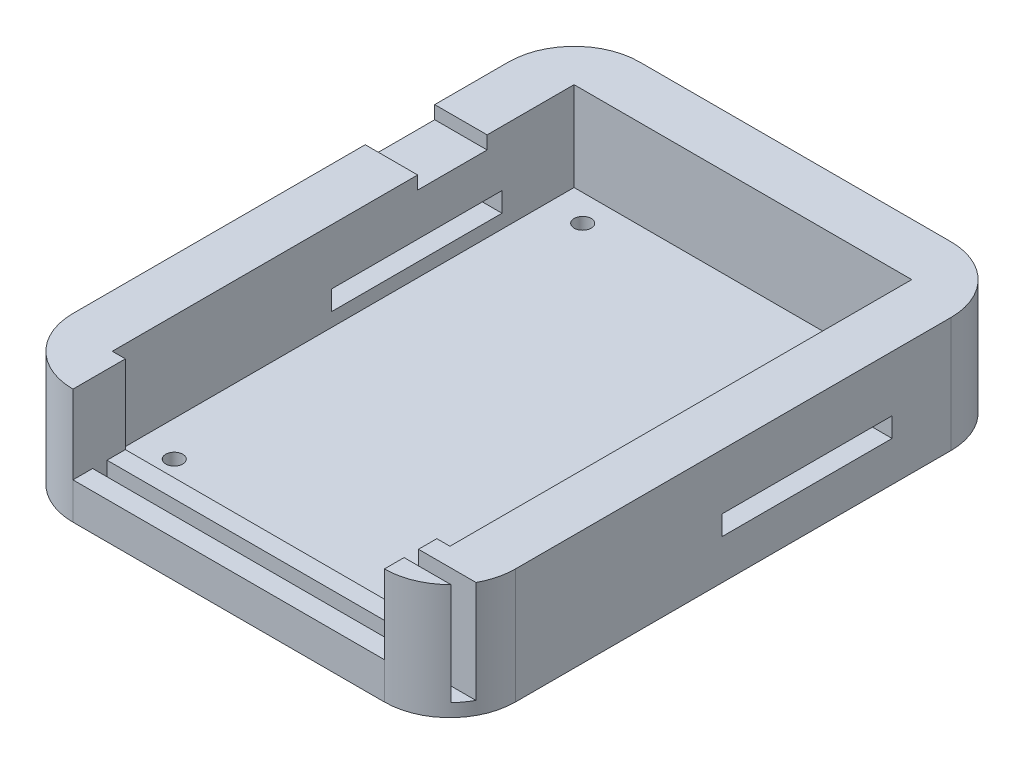
ISO-10303-21;
HEADER;
FILE_DESCRIPTION(('STEP AP214'),'2;1');
FILE_NAME('part.step','',(''),(''),'','','');
FILE_SCHEMA(('AUTOMOTIVE_DESIGN { 1 0 10303 214 1 1 1 1 }'));
ENDSEC;
DATA;
#1=APPLICATION_CONTEXT('core data for automotive mechanical design processes');
#2=APPLICATION_PROTOCOL_DEFINITION('international standard','automotive_design',2000,#1);
#3=PRODUCT_CONTEXT('',#1,'mechanical');
#4=PRODUCT('Part','Part','',(#3));
#5=PRODUCT_RELATED_PRODUCT_CATEGORY('part','',(#4));
#6=PRODUCT_DEFINITION_FORMATION('','',#4);
#7=PRODUCT_DEFINITION_CONTEXT('part definition',#1,'design');
#8=PRODUCT_DEFINITION('design','',#6,#7);
#9=PRODUCT_DEFINITION_SHAPE('','',#8);
#10=(LENGTH_UNIT() NAMED_UNIT(*) SI_UNIT(.MILLI.,.METRE.));
#11=(NAMED_UNIT(*) PLANE_ANGLE_UNIT() SI_UNIT($,.RADIAN.));
#12=(NAMED_UNIT(*) SI_UNIT($,.STERADIAN.) SOLID_ANGLE_UNIT());
#13=UNCERTAINTY_MEASURE_WITH_UNIT(LENGTH_MEASURE(1.E-05),#10,'distance_accuracy_value','');
#14=(GEOMETRIC_REPRESENTATION_CONTEXT(3) GLOBAL_UNCERTAINTY_ASSIGNED_CONTEXT((#13)) GLOBAL_UNIT_ASSIGNED_CONTEXT((#10,
#11,#12)) REPRESENTATION_CONTEXT('',''));
#15=CARTESIAN_POINT('',(0.,0.,0.));
#16=DIRECTION('',(0.,0.,1.));
#17=DIRECTION('',(1.,0.,0.));
#18=AXIS2_PLACEMENT_3D('',#15,#16,#17);
#19=CARTESIAN_POINT('',(-23.775,17.6,-33.25));
#20=DIRECTION('',(0.,1.,0.));
#21=DIRECTION('',(0.,0.,1.));
#22=AXIS2_PLACEMENT_3D('',#19,#20,#21);
#23=PLANE('',#22);
#24=DIRECTION('',(1.,0.,0.));
#25=VECTOR('',#24,1.);
#26=CARTESIAN_POINT('',(-25.775,17.6,-11.37057));
#27=LINE('',#26,#25);
#28=CARTESIAN_POINT('',(-33.775,17.6,-11.37057));
#29=VERTEX_POINT('',#28);
#30=CARTESIAN_POINT('',(-25.775,17.6,-11.37057));
#31=VERTEX_POINT('',#30);
#32=EDGE_CURVE('E315',#29,#31,#27,.T.);
#33=ORIENTED_EDGE('',*,*,#32,.F.);
#34=DIRECTION('',(0.,0.,-1.));
#35=VECTOR('',#34,1.);
#36=CARTESIAN_POINT('',(-33.775,17.6,33.25));
#37=LINE('',#36,#35);
#38=CARTESIAN_POINT('',(-33.775,17.6,33.25));
#39=VERTEX_POINT('',#38);
#40=EDGE_CURVE('E433',#39,#29,#37,.T.);
#41=ORIENTED_EDGE('',*,*,#40,.F.);
#42=CARTESIAN_POINT('',(-23.775,17.6,33.25));
#43=DIRECTION('',(0.,-1.,0.));
#44=DIRECTION('',(0.,0.,1.));
#45=AXIS2_PLACEMENT_3D('',#42,#43,#44);
#46=CIRCLE('',#45,10.);
#47=CARTESIAN_POINT('',(-23.775,17.6,43.25));
#48=VERTEX_POINT('',#47);
#49=EDGE_CURVE('E429',#48,#39,#46,.T.);
#50=ORIENTED_EDGE('',*,*,#49,.F.);
#51=DIRECTION('',(0.,0.,1.));
#52=VECTOR('',#51,1.);
#53=CARTESIAN_POINT('',(-23.775,17.6,43.25));
#54=LINE('',#53,#52);
#55=CARTESIAN_POINT('',(-23.775,17.6,35.25));
#56=VERTEX_POINT('',#55);
#57=EDGE_CURVE('E380',#56,#48,#54,.T.);
#58=ORIENTED_EDGE('',*,*,#57,.F.);
#59=DIRECTION('',(-1.,0.,0.));
#60=VECTOR('',#59,1.);
#61=CARTESIAN_POINT('',(-25.775,17.6,35.25));
#62=LINE('',#61,#60);
#63=CARTESIAN_POINT('',(-25.775,17.6,35.25));
#64=VERTEX_POINT('',#63);
#65=EDGE_CURVE('E396',#56,#64,#62,.T.);
#66=ORIENTED_EDGE('',*,*,#65,.T.);
#67=DIRECTION('',(0.,0.,-1.));
#68=VECTOR('',#67,1.);
#69=CARTESIAN_POINT('',(-25.775,17.6,-35.25));
#70=LINE('',#69,#68);
#71=EDGE_CURVE('E387',#64,#31,#70,.T.);
#72=ORIENTED_EDGE('',*,*,#71,.T.);
#73=EDGE_LOOP('',(#33,#41,#50,#58,#66,#72));
#74=FACE_BOUND('',#73,.T.);
#75=ADVANCED_FACE('F41',(#74),#23,.T.);
#76=DIRECTION('',(-1.,0.,0.));
#77=VECTOR('',#76,1.);
#78=CARTESIAN_POINT('',(-25.775,17.6,-21.97704));
#79=LINE('',#78,#77);
#80=CARTESIAN_POINT('',(-25.775,17.6,-21.97704));
#81=VERTEX_POINT('',#80);
#82=CARTESIAN_POINT('',(-33.775,17.6,-21.97704));
#83=VERTEX_POINT('',#82);
#84=EDGE_CURVE('E310',#81,#83,#79,.T.);
#85=ORIENTED_EDGE('',*,*,#84,.F.);
#86=CARTESIAN_POINT('',(-25.775,17.6,-35.25));
#87=VERTEX_POINT('',#86);
#88=EDGE_CURVE('E384',#81,#87,#70,.T.);
#89=ORIENTED_EDGE('',*,*,#88,.T.);
#90=DIRECTION('',(1.,0.,0.));
#91=VECTOR('',#90,1.);
#92=CARTESIAN_POINT('',(25.775,17.6,-35.25));
#93=LINE('',#92,#91);
#94=CARTESIAN_POINT('',(25.775,17.6,-35.25));
#95=VERTEX_POINT('',#94);
#96=EDGE_CURVE('E390',#87,#95,#93,.T.);
#97=ORIENTED_EDGE('',*,*,#96,.T.);
#98=DIRECTION('',(0.,0.,1.));
#99=VECTOR('',#98,1.);
#100=CARTESIAN_POINT('',(25.775,17.6,35.25));
#101=LINE('',#100,#99);
#102=CARTESIAN_POINT('',(25.775,17.6,35.25));
#103=VERTEX_POINT('',#102);
#104=EDGE_CURVE('E393',#95,#103,#101,.T.);
#105=ORIENTED_EDGE('',*,*,#104,.T.);
#106=CARTESIAN_POINT('',(23.775,17.6,35.25));
#107=VERTEX_POINT('',#106);
#108=EDGE_CURVE('E397',#103,#107,#62,.T.);
#109=ORIENTED_EDGE('',*,*,#108,.T.);
#110=DIRECTION('',(0.,0.,-1.));
#111=VECTOR('',#110,1.);
#112=CARTESIAN_POINT('',(23.775,17.6,43.25));
#113=LINE('',#112,#111);
#114=CARTESIAN_POINT('',(23.775,17.6,38.05));
#115=VERTEX_POINT('',#114);
#116=EDGE_CURVE('E361',#115,#107,#113,.T.);
#117=ORIENTED_EDGE('',*,*,#116,.F.);
#118=DIRECTION('',(1.,0.,0.));
#119=VECTOR('',#118,1.);
#120=CARTESIAN_POINT('',(-23.775,17.6,38.05));
#121=LINE('',#120,#119);
#122=CARTESIAN_POINT('',(32.5476848797845,17.6,38.05));
#123=VERTEX_POINT('',#122);
#124=EDGE_CURVE('E345',#115,#123,#121,.T.);
#125=ORIENTED_EDGE('',*,*,#124,.T.);
#126=CARTESIAN_POINT('',(23.775,17.6,33.25));
#127=DIRECTION('',(0.,-1.,0.));
#128=DIRECTION('',(0.,0.,-1.));
#129=AXIS2_PLACEMENT_3D('',#126,#127,#128);
#130=CIRCLE('',#129,10.);
#131=CARTESIAN_POINT('',(33.775,17.6,33.25));
#132=VERTEX_POINT('',#131);
#133=EDGE_CURVE('E426',#132,#123,#130,.T.);
#134=ORIENTED_EDGE('',*,*,#133,.F.);
#135=DIRECTION('',(0.,0.,1.));
#136=VECTOR('',#135,1.);
#137=CARTESIAN_POINT('',(33.775,17.6,33.25));
#138=LINE('',#137,#136);
#139=CARTESIAN_POINT('',(33.775,17.6,-33.25));
#140=VERTEX_POINT('',#139);
#141=EDGE_CURVE('E422',#140,#132,#138,.T.);
#142=ORIENTED_EDGE('',*,*,#141,.F.);
#143=CARTESIAN_POINT('',(23.775,17.6,-33.25));
#144=DIRECTION('',(0.,-1.,0.));
#145=DIRECTION('',(0.,0.,-1.));
#146=AXIS2_PLACEMENT_3D('',#143,#144,#145);
#147=CIRCLE('',#146,10.);
#148=CARTESIAN_POINT('',(23.775,17.6,-43.25));
#149=VERTEX_POINT('',#148);
#150=EDGE_CURVE('E419',#149,#140,#147,.T.);
#151=ORIENTED_EDGE('',*,*,#150,.F.);
#152=DIRECTION('',(1.,0.,0.));
#153=VECTOR('',#152,1.);
#154=CARTESIAN_POINT('',(-23.775,17.6,-43.25));
#155=LINE('',#154,#153);
#156=CARTESIAN_POINT('',(-23.775,17.6,-43.25));
#157=VERTEX_POINT('',#156);
#158=EDGE_CURVE('E415',#157,#149,#155,.T.);
#159=ORIENTED_EDGE('',*,*,#158,.F.);
#160=CARTESIAN_POINT('',(-23.775,17.6,-33.25));
#161=DIRECTION('',(0.,-1.,0.));
#162=DIRECTION('',(0.,0.,1.));
#163=AXIS2_PLACEMENT_3D('',#160,#161,#162);
#164=CIRCLE('',#163,10.);
#165=CARTESIAN_POINT('',(-33.775,17.6,-33.25));
#166=VERTEX_POINT('',#165);
#167=EDGE_CURVE('E412',#166,#157,#164,.T.);
#168=ORIENTED_EDGE('',*,*,#167,.F.);
#169=EDGE_CURVE('E432',#83,#166,#37,.T.);
#170=ORIENTED_EDGE('',*,*,#169,.F.);
#171=EDGE_LOOP('',(#85,#89,#97,#105,#109,#117,#125,#134,#142,#151,#159,#168,#170));
#172=FACE_BOUND('',#171,.T.);
#173=ADVANCED_FACE('F589',(#172),#23,.T.);
#174=CARTESIAN_POINT('',(23.775,5.6,43.25));
#175=DIRECTION('',(1.,0.,0.));
#176=DIRECTION('',(0.,0.,-1.));
#177=AXIS2_PLACEMENT_3D('',#174,#175,#176);
#178=PLANE('',#177);
#179=DIRECTION('',(0.,-1.,0.));
#180=VECTOR('',#179,1.);
#181=CARTESIAN_POINT('',(23.775,5.6,38.05));
#182=LINE('',#181,#180);
#183=CARTESIAN_POINT('',(23.775,5.6,38.05));
#184=VERTEX_POINT('',#183);
#185=EDGE_CURVE('E351',#115,#184,#182,.T.);
#186=ORIENTED_EDGE('',*,*,#185,.F.);
#187=ORIENTED_EDGE('',*,*,#116,.T.);
#188=DIRECTION('',(0.,1.,0.));
#189=VECTOR('',#188,1.);
#190=CARTESIAN_POINT('',(23.775,5.6,35.25));
#191=LINE('',#190,#189);
#192=CARTESIAN_POINT('',(23.775,5.6,35.25));
#193=VERTEX_POINT('',#192);
#194=EDGE_CURVE('E376',#193,#107,#191,.T.);
#195=ORIENTED_EDGE('',*,*,#194,.F.);
#196=DIRECTION('',(0.,0.,-1.));
#197=VECTOR('',#196,1.);
#198=CARTESIAN_POINT('',(23.775,5.6,43.25));
#199=LINE('',#198,#197);
#200=EDGE_CURVE('E366',#184,#193,#199,.T.);
#201=ORIENTED_EDGE('',*,*,#200,.F.);
#202=EDGE_LOOP('',(#186,#187,#195,#201));
#203=FACE_BOUND('',#202,.T.);
#204=ADVANCED_FACE('F585',(#203),#178,.F.);
#205=CARTESIAN_POINT('',(0.,5.6,0.));
#206=DIRECTION('',(0.,1.,0.));
#207=DIRECTION('',(0.,0.,1.));
#208=AXIS2_PLACEMENT_3D('',#205,#206,#207);
#209=PLANE('',#208);
#210=DIRECTION('',(0.,0.,1.));
#211=VECTOR('',#210,1.);
#212=CARTESIAN_POINT('',(-23.775,5.6,43.25));
#213=LINE('',#212,#211);
#214=CARTESIAN_POINT('',(-23.775,5.6,35.25));
#215=VERTEX_POINT('',#214);
#216=CARTESIAN_POINT('',(-23.775,5.6,38.05));
#217=VERTEX_POINT('',#216);
#218=EDGE_CURVE('E370',#215,#217,#213,.T.);
#219=ORIENTED_EDGE('',*,*,#218,.T.);
#220=DIRECTION('',(1.,0.,0.));
#221=VECTOR('',#220,1.);
#222=CARTESIAN_POINT('',(0.,5.6,38.05));
#223=LINE('',#222,#221);
#224=EDGE_CURVE('E514',#217,#184,#223,.T.);
#225=ORIENTED_EDGE('',*,*,#224,.T.);
#226=ORIENTED_EDGE('',*,*,#200,.T.);
#227=DIRECTION('',(-1.,0.,0.));
#228=VECTOR('',#227,1.);
#229=CARTESIAN_POINT('',(23.775,5.6,35.25));
#230=LINE('',#229,#228);
#231=EDGE_CURVE('E365',#193,#215,#230,.T.);
#232=ORIENTED_EDGE('',*,*,#231,.T.);
#233=EDGE_LOOP('',(#219,#225,#226,#232));
#234=FACE_BOUND('',#233,.T.);
#235=ADVANCED_FACE('F580',(#234),#209,.T.);
#236=CARTESIAN_POINT('',(-23.775,17.6,43.25));
#237=DIRECTION('',(0.,0.,1.));
#238=DIRECTION('',(1.,0.,0.));
#239=AXIS2_PLACEMENT_3D('',#236,#237,#238);
#240=PLANE('',#239);
#241=DIRECTION('',(0.,-1.,0.));
#242=VECTOR('',#241,1.);
#243=CARTESIAN_POINT('',(23.775,17.6,43.25));
#244=LINE('',#243,#242);
#245=CARTESIAN_POINT('',(23.775,5.6,43.25));
#246=VERTEX_POINT('',#245);
#247=CARTESIAN_POINT('',(23.775,0.,43.25));
#248=VERTEX_POINT('',#247);
#249=EDGE_CURVE('E471',#246,#248,#244,.T.);
#250=ORIENTED_EDGE('',*,*,#249,.F.);
#251=DIRECTION('',(1.,0.,0.));
#252=VECTOR('',#251,1.);
#253=CARTESIAN_POINT('',(23.775,5.6,43.25));
#254=LINE('',#253,#252);
#255=CARTESIAN_POINT('',(-23.775,5.6,43.25));
#256=VERTEX_POINT('',#255);
#257=EDGE_CURVE('E373',#256,#246,#254,.T.);
#258=ORIENTED_EDGE('',*,*,#257,.F.);
#259=DIRECTION('',(0.,-1.,0.));
#260=VECTOR('',#259,1.);
#261=CARTESIAN_POINT('',(-23.775,17.6,43.25));
#262=LINE('',#261,#260);
#263=CARTESIAN_POINT('',(-23.775,0.,43.25));
#264=VERTEX_POINT('',#263);
#265=EDGE_CURVE('E467',#256,#264,#262,.T.);
#266=ORIENTED_EDGE('',*,*,#265,.T.);
#267=DIRECTION('',(-1.,0.,0.));
#268=VECTOR('',#267,1.);
#269=CARTESIAN_POINT('',(-23.775,0.,43.25));
#270=LINE('',#269,#268);
#271=EDGE_CURVE('E451',#248,#264,#270,.T.);
#272=ORIENTED_EDGE('',*,*,#271,.F.);
#273=EDGE_LOOP('',(#250,#258,#266,#272));
#274=FACE_BOUND('',#273,.T.);
#275=ADVANCED_FACE('F615',(#274),#240,.T.);
#276=CARTESIAN_POINT('',(0.,4.,0.));
#277=DIRECTION('',(0.,-1.,0.));
#278=DIRECTION('',(0.,0.,-1.));
#279=AXIS2_PLACEMENT_3D('',#276,#277,#278);
#280=PLANE('',#279);
#281=DIRECTION('',(0.,0.,-1.));
#282=VECTOR('',#281,1.);
#283=CARTESIAN_POINT('',(25.775,4.,35.25));
#284=LINE('',#283,#282);
#285=CARTESIAN_POINT('',(25.775,4.,35.25));
#286=VERTEX_POINT('',#285);
#287=CARTESIAN_POINT('',(25.775,4.,-35.25));
#288=VERTEX_POINT('',#287);
#289=EDGE_CURVE('E500',#286,#288,#284,.T.);
#290=ORIENTED_EDGE('',*,*,#289,.T.);
#291=DIRECTION('',(-1.,0.,0.));
#292=VECTOR('',#291,1.);
#293=CARTESIAN_POINT('',(-25.775,4.,-35.25));
#294=LINE('',#293,#292);
#295=CARTESIAN_POINT('',(-25.775,4.,-35.25));
#296=VERTEX_POINT('',#295);
#297=EDGE_CURVE('E505',#288,#296,#294,.T.);
#298=ORIENTED_EDGE('',*,*,#297,.T.);
#299=DIRECTION('',(0.,0.,1.));
#300=VECTOR('',#299,1.);
#301=CARTESIAN_POINT('',(-25.775,4.,35.25));
#302=LINE('',#301,#300);
#303=CARTESIAN_POINT('',(-25.775,4.,35.25));
#304=VERTEX_POINT('',#303);
#305=EDGE_CURVE('E508',#296,#304,#302,.T.);
#306=ORIENTED_EDGE('',*,*,#305,.T.);
#307=DIRECTION('',(1.,0.,0.));
#308=VECTOR('',#307,1.);
#309=CARTESIAN_POINT('',(-25.775,4.,35.25));
#310=LINE('',#309,#308);
#311=EDGE_CURVE('E511',#304,#286,#310,.T.);
#312=ORIENTED_EDGE('',*,*,#311,.T.);
#313=EDGE_LOOP('',(#290,#298,#306,#312));
#314=FACE_BOUND('',#313,.T.);
#315=CARTESIAN_POINT('',(-20.3835,4.,-31.1785));
#316=DIRECTION('',(0.,1.,0.));
#317=DIRECTION('',(0.,0.,1.));
#318=AXIS2_PLACEMENT_3D('',#315,#316,#317);
#319=CIRCLE('',#318,1.3);
#320=CARTESIAN_POINT('',(-20.3835,4.,-29.8785));
#321=VERTEX_POINT('',#320);
#322=EDGE_CURVE('E497',#321,#321,#319,.T.);
#323=ORIENTED_EDGE('',*,*,#322,.F.);
#324=EDGE_LOOP('',(#323));
#325=FACE_BOUND('',#324,.T.);
#326=CARTESIAN_POINT('',(20.3835,4.,-31.1785));
#327=DIRECTION('',(0.,1.,0.));
#328=DIRECTION('',(0.,0.,-1.));
#329=AXIS2_PLACEMENT_3D('',#326,#327,#328);
#330=CIRCLE('',#329,1.3);
#331=CARTESIAN_POINT('',(20.3835,4.,-32.4785));
#332=VERTEX_POINT('',#331);
#333=EDGE_CURVE('E491',#332,#332,#330,.T.);
#334=ORIENTED_EDGE('',*,*,#333,.F.);
#335=EDGE_LOOP('',(#334));
#336=FACE_BOUND('',#335,.T.);
#337=CARTESIAN_POINT('',(20.3835,4.,31.1785));
#338=DIRECTION('',(0.,1.,0.));
#339=DIRECTION('',(0.,0.,1.));
#340=AXIS2_PLACEMENT_3D('',#337,#338,#339);
#341=CIRCLE('',#340,1.3);
#342=CARTESIAN_POINT('',(20.3835,4.,32.4785));
#343=VERTEX_POINT('',#342);
#344=EDGE_CURVE('E485',#343,#343,#341,.T.);
#345=ORIENTED_EDGE('',*,*,#344,.F.);
#346=EDGE_LOOP('',(#345));
#347=FACE_BOUND('',#346,.T.);
#348=CARTESIAN_POINT('',(-20.3835,4.,31.1785));
#349=DIRECTION('',(0.,1.,0.));
#350=DIRECTION('',(0.,0.,-1.));
#351=AXIS2_PLACEMENT_3D('',#348,#349,#350);
#352=CIRCLE('',#351,1.3);
#353=CARTESIAN_POINT('',(-20.3835,4.,29.8785));
#354=VERTEX_POINT('',#353);
#355=EDGE_CURVE('E479',#354,#354,#352,.T.);
#356=ORIENTED_EDGE('',*,*,#355,.F.);
#357=EDGE_LOOP('',(#356));
#358=FACE_BOUND('',#357,.T.);
#359=ADVANCED_FACE('F555',(#314,#325,#336,#347,#358),#280,.F.);
#360=CARTESIAN_POINT('',(0.,0.,0.));
#361=DIRECTION('',(0.,-1.,0.));
#362=DIRECTION('',(0.,0.,-1.));
#363=AXIS2_PLACEMENT_3D('',#360,#361,#362);
#364=PLANE('',#363);
#365=CARTESIAN_POINT('',(20.3835,0.,31.1785));
#366=DIRECTION('',(0.,1.,0.));
#367=DIRECTION('',(0.,0.,1.));
#368=AXIS2_PLACEMENT_3D('',#365,#366,#367);
#369=CIRCLE('',#368,1.3);
#370=CARTESIAN_POINT('',(20.3835,0.,32.4785));
#371=VERTEX_POINT('',#370);
#372=EDGE_CURVE('E482',#371,#371,#369,.T.);
#373=ORIENTED_EDGE('',*,*,#372,.T.);
#374=EDGE_LOOP('',(#373));
#375=FACE_BOUND('',#374,.T.);
#376=CARTESIAN_POINT('',(-20.3835,0.,-31.1785));
#377=DIRECTION('',(0.,1.,0.));
#378=DIRECTION('',(0.,0.,1.));
#379=AXIS2_PLACEMENT_3D('',#376,#377,#378);
#380=CIRCLE('',#379,1.3);
#381=CARTESIAN_POINT('',(-20.3835,0.,-29.8785));
#382=VERTEX_POINT('',#381);
#383=EDGE_CURVE('E494',#382,#382,#380,.T.);
#384=ORIENTED_EDGE('',*,*,#383,.T.);
#385=EDGE_LOOP('',(#384));
#386=FACE_BOUND('',#385,.T.);
#387=CARTESIAN_POINT('',(20.3835,0.,-31.1785));
#388=DIRECTION('',(0.,1.,0.));
#389=DIRECTION('',(0.,0.,-1.));
#390=AXIS2_PLACEMENT_3D('',#387,#388,#389);
#391=CIRCLE('',#390,1.3);
#392=CARTESIAN_POINT('',(20.3835,0.,-32.4785));
#393=VERTEX_POINT('',#392);
#394=EDGE_CURVE('E488',#393,#393,#391,.T.);
#395=ORIENTED_EDGE('',*,*,#394,.T.);
#396=EDGE_LOOP('',(#395));
#397=FACE_BOUND('',#396,.T.);
#398=CARTESIAN_POINT('',(-20.3835,0.,31.1785));
#399=DIRECTION('',(0.,1.,0.));
#400=DIRECTION('',(0.,0.,-1.));
#401=AXIS2_PLACEMENT_3D('',#398,#399,#400);
#402=CIRCLE('',#401,1.3);
#403=CARTESIAN_POINT('',(-20.3835,0.,29.8785));
#404=VERTEX_POINT('',#403);
#405=EDGE_CURVE('E461',#404,#404,#402,.T.);
#406=ORIENTED_EDGE('',*,*,#405,.T.);
#407=EDGE_LOOP('',(#406));
#408=FACE_BOUND('',#407,.T.);
#409=CARTESIAN_POINT('',(-23.775,0.,-33.25));
#410=DIRECTION('',(0.,-1.,0.));
#411=DIRECTION('',(0.,0.,1.));
#412=AXIS2_PLACEMENT_3D('',#409,#410,#411);
#413=CIRCLE('',#412,10.);
#414=CARTESIAN_POINT('',(-33.775,0.,-33.25));
#415=VERTEX_POINT('',#414);
#416=CARTESIAN_POINT('',(-23.775,0.,-43.25));
#417=VERTEX_POINT('',#416);
#418=EDGE_CURVE('E404',#415,#417,#413,.T.);
#419=ORIENTED_EDGE('',*,*,#418,.T.);
#420=DIRECTION('',(1.,0.,0.));
#421=VECTOR('',#420,1.);
#422=CARTESIAN_POINT('',(-23.775,0.,-43.25));
#423=LINE('',#422,#421);
#424=CARTESIAN_POINT('',(23.775,0.,-43.25));
#425=VERTEX_POINT('',#424);
#426=EDGE_CURVE('E439',#417,#425,#423,.T.);
#427=ORIENTED_EDGE('',*,*,#426,.T.);
#428=CARTESIAN_POINT('',(23.775,0.,-33.25));
#429=DIRECTION('',(0.,-1.,0.));
#430=DIRECTION('',(0.,0.,-1.));
#431=AXIS2_PLACEMENT_3D('',#428,#429,#430);
#432=CIRCLE('',#431,10.);
#433=CARTESIAN_POINT('',(33.775,0.,-33.25));
#434=VERTEX_POINT('',#433);
#435=EDGE_CURVE('E442',#425,#434,#432,.T.);
#436=ORIENTED_EDGE('',*,*,#435,.T.);
#437=DIRECTION('',(0.,0.,1.));
#438=VECTOR('',#437,1.);
#439=CARTESIAN_POINT('',(33.775,0.,33.25));
#440=LINE('',#439,#438);
#441=CARTESIAN_POINT('',(33.775,0.,33.25));
#442=VERTEX_POINT('',#441);
#443=EDGE_CURVE('E445',#434,#442,#440,.T.);
#444=ORIENTED_EDGE('',*,*,#443,.T.);
#445=CARTESIAN_POINT('',(23.775,0.,33.25));
#446=DIRECTION('',(0.,-1.,0.));
#447=DIRECTION('',(0.,0.,-1.));
#448=AXIS2_PLACEMENT_3D('',#445,#446,#447);
#449=CIRCLE('',#448,10.);
#450=EDGE_CURVE('E448',#442,#248,#449,.T.);
#451=ORIENTED_EDGE('',*,*,#450,.T.);
#452=ORIENTED_EDGE('',*,*,#271,.T.);
#453=CARTESIAN_POINT('',(-23.775,0.,33.25));
#454=DIRECTION('',(0.,-1.,0.));
#455=DIRECTION('',(0.,0.,1.));
#456=AXIS2_PLACEMENT_3D('',#453,#454,#455);
#457=CIRCLE('',#456,10.);
#458=CARTESIAN_POINT('',(-33.775,0.,33.25));
#459=VERTEX_POINT('',#458);
#460=EDGE_CURVE('E454',#264,#459,#457,.T.);
#461=ORIENTED_EDGE('',*,*,#460,.T.);
#462=DIRECTION('',(0.,0.,-1.));
#463=VECTOR('',#462,1.);
#464=CARTESIAN_POINT('',(-33.775,0.,33.25));
#465=LINE('',#464,#463);
#466=EDGE_CURVE('E416',#459,#415,#465,.T.);
#467=ORIENTED_EDGE('',*,*,#466,.T.);
#468=EDGE_LOOP('',(#419,#427,#436,#444,#451,#452,#461,#467));
#469=FACE_BOUND('',#468,.T.);
#470=ADVANCED_FACE('F43',(#375,#386,#397,#408,#469),#364,.T.);
#471=CARTESIAN_POINT('',(-20.3835,4.,-31.1785));
#472=DIRECTION('',(0.,-1.,0.));
#473=DIRECTION('',(0.,0.,-1.));
#474=AXIS2_PLACEMENT_3D('',#471,#472,#473);
#475=CYLINDRICAL_SURFACE('',#474,1.3);
#476=ORIENTED_EDGE('',*,*,#322,.T.);
#477=EDGE_LOOP('',(#476));
#478=FACE_BOUND('',#477,.T.);
#479=ORIENTED_EDGE('',*,*,#383,.F.);
#480=EDGE_LOOP('',(#479));
#481=FACE_BOUND('',#480,.T.);
#482=ADVANCED_FACE('F977',(#478,#481),#475,.F.);
#483=CARTESIAN_POINT('',(20.3835,4.,-31.1785));
#484=DIRECTION('',(0.,-1.,0.));
#485=DIRECTION('',(0.,0.,-1.));
#486=AXIS2_PLACEMENT_3D('',#483,#484,#485);
#487=CYLINDRICAL_SURFACE('',#486,1.3);
#488=ORIENTED_EDGE('',*,*,#333,.T.);
#489=EDGE_LOOP('',(#488));
#490=FACE_BOUND('',#489,.T.);
#491=ORIENTED_EDGE('',*,*,#394,.F.);
#492=EDGE_LOOP('',(#491));
#493=FACE_BOUND('',#492,.T.);
#494=ADVANCED_FACE('F967',(#490,#493),#487,.F.);
#495=CARTESIAN_POINT('',(20.3835,4.,31.1785));
#496=DIRECTION('',(0.,-1.,0.));
#497=DIRECTION('',(0.,0.,-1.));
#498=AXIS2_PLACEMENT_3D('',#495,#496,#497);
#499=CYLINDRICAL_SURFACE('',#498,1.3);
#500=ORIENTED_EDGE('',*,*,#344,.T.);
#501=EDGE_LOOP('',(#500));
#502=FACE_BOUND('',#501,.T.);
#503=ORIENTED_EDGE('',*,*,#372,.F.);
#504=EDGE_LOOP('',(#503));
#505=FACE_BOUND('',#504,.T.);
#506=ADVANCED_FACE('F957',(#502,#505),#499,.F.);
#507=CARTESIAN_POINT('',(-20.3835,4.,31.1785));
#508=DIRECTION('',(0.,-1.,0.));
#509=DIRECTION('',(0.,0.,-1.));
#510=AXIS2_PLACEMENT_3D('',#507,#508,#509);
#511=CYLINDRICAL_SURFACE('',#510,1.3);
#512=ORIENTED_EDGE('',*,*,#355,.T.);
#513=EDGE_LOOP('',(#512));
#514=FACE_BOUND('',#513,.T.);
#515=ORIENTED_EDGE('',*,*,#405,.F.);
#516=EDGE_LOOP('',(#515));
#517=FACE_BOUND('',#516,.T.);
#518=ADVANCED_FACE('F948',(#514,#517),#511,.F.);
#519=CARTESIAN_POINT('',(-25.775,17.6,35.25));
#520=DIRECTION('',(0.,0.,1.));
#521=DIRECTION('',(1.,0.,0.));
#522=AXIS2_PLACEMENT_3D('',#519,#520,#521);
#523=PLANE('',#522);
#524=ORIENTED_EDGE('',*,*,#231,.F.);
#525=ORIENTED_EDGE('',*,*,#194,.T.);
#526=ORIENTED_EDGE('',*,*,#108,.F.);
#527=DIRECTION('',(0.,-1.,0.));
#528=VECTOR('',#527,1.);
#529=CARTESIAN_POINT('',(25.775,17.6,35.25));
#530=LINE('',#529,#528);
#531=EDGE_CURVE('E405',#103,#286,#530,.T.);
#532=ORIENTED_EDGE('',*,*,#531,.T.);
#533=ORIENTED_EDGE('',*,*,#311,.F.);
#534=DIRECTION('',(0.,-1.,0.));
#535=VECTOR('',#534,1.);
#536=CARTESIAN_POINT('',(-25.775,17.6,35.25));
#537=LINE('',#536,#535);
#538=EDGE_CURVE('E401',#64,#304,#537,.T.);
#539=ORIENTED_EDGE('',*,*,#538,.F.);
#540=ORIENTED_EDGE('',*,*,#65,.F.);
#541=DIRECTION('',(0.,1.,0.));
#542=VECTOR('',#541,1.);
#543=CARTESIAN_POINT('',(-23.775,5.6,35.25));
#544=LINE('',#543,#542);
#545=EDGE_CURVE('E382',#215,#56,#544,.T.);
#546=ORIENTED_EDGE('',*,*,#545,.F.);
#547=EDGE_LOOP('',(#524,#525,#526,#532,#533,#539,#540,#546));
#548=FACE_BOUND('',#547,.T.);
#549=ADVANCED_FACE('F561',(#548),#523,.F.);
#550=CARTESIAN_POINT('',(25.775,17.6,-35.25));
#551=DIRECTION('',(0.,0.,-1.));
#552=DIRECTION('',(-1.,0.,0.));
#553=AXIS2_PLACEMENT_3D('',#550,#551,#552);
#554=PLANE('',#553);
#555=DIRECTION('',(0.,-1.,0.));
#556=VECTOR('',#555,1.);
#557=CARTESIAN_POINT('',(-25.775,17.6,-35.25));
#558=LINE('',#557,#556);
#559=EDGE_CURVE('E400',#87,#296,#558,.T.);
#560=ORIENTED_EDGE('',*,*,#559,.T.);
#561=ORIENTED_EDGE('',*,*,#297,.F.);
#562=DIRECTION('',(0.,-1.,0.));
#563=VECTOR('',#562,1.);
#564=CARTESIAN_POINT('',(25.775,17.6,-35.25));
#565=LINE('',#564,#563);
#566=EDGE_CURVE('E408',#95,#288,#565,.T.);
#567=ORIENTED_EDGE('',*,*,#566,.F.);
#568=ORIENTED_EDGE('',*,*,#96,.F.);
#569=EDGE_LOOP('',(#560,#561,#567,#568));
#570=FACE_BOUND('',#569,.T.);
#571=ADVANCED_FACE('F591',(#570),#554,.F.);
#572=CARTESIAN_POINT('',(-25.775,17.6,-35.25));
#573=DIRECTION('',(-1.,0.,0.));
#574=DIRECTION('',(0.,0.,1.));
#575=AXIS2_PLACEMENT_3D('',#572,#573,#574);
#576=PLANE('',#575);
#577=DIRECTION('',(0.,0.,-1.));
#578=VECTOR('',#577,1.);
#579=CARTESIAN_POINT('',(-25.775,9.1,-35.25));
#580=LINE('',#579,#578);
#581=CARTESIAN_POINT('',(-25.775,9.1,1.75000000000001));
#582=VERTEX_POINT('',#581);
#583=CARTESIAN_POINT('',(-25.775,9.1,-24.25));
#584=VERTEX_POINT('',#583);
#585=EDGE_CURVE('E301',#582,#584,#580,.T.);
#586=ORIENTED_EDGE('',*,*,#585,.T.);
#587=DIRECTION('',(0.,-1.,0.));
#588=VECTOR('',#587,1.);
#589=CARTESIAN_POINT('',(-25.775,17.6,-24.25));
#590=LINE('',#589,#588);
#591=CARTESIAN_POINT('',(-25.775,6.1,-24.25));
#592=VERTEX_POINT('',#591);
#593=EDGE_CURVE('E307',#584,#592,#590,.T.);
#594=ORIENTED_EDGE('',*,*,#593,.T.);
#595=DIRECTION('',(0.,0.,1.));
#596=VECTOR('',#595,1.);
#597=CARTESIAN_POINT('',(-25.775,6.1,-35.25));
#598=LINE('',#597,#596);
#599=CARTESIAN_POINT('',(-25.775,6.1,1.75));
#600=VERTEX_POINT('',#599);
#601=EDGE_CURVE('E292',#592,#600,#598,.T.);
#602=ORIENTED_EDGE('',*,*,#601,.T.);
#603=DIRECTION('',(0.,1.,0.));
#604=VECTOR('',#603,1.);
#605=CARTESIAN_POINT('',(-25.775,17.6,1.75000000000001));
#606=LINE('',#605,#604);
#607=EDGE_CURVE('E260',#600,#582,#606,.T.);
#608=ORIENTED_EDGE('',*,*,#607,.T.);
#609=EDGE_LOOP('',(#586,#594,#602,#608));
#610=FACE_BOUND('',#609,.T.);
#611=DIRECTION('',(0.,0.,-1.));
#612=VECTOR('',#611,1.);
#613=CARTESIAN_POINT('',(-25.775,15.6,-21.97704));
#614=LINE('',#613,#612);
#615=CARTESIAN_POINT('',(-25.775,15.6,-11.37057));
#616=VERTEX_POINT('',#615);
#617=CARTESIAN_POINT('',(-25.775,15.6,-21.97704));
#618=VERTEX_POINT('',#617);
#619=EDGE_CURVE('E311',#616,#618,#614,.T.);
#620=ORIENTED_EDGE('',*,*,#619,.F.);
#621=DIRECTION('',(0.,1.,0.));
#622=VECTOR('',#621,1.);
#623=CARTESIAN_POINT('',(-25.775,15.6,-11.37057));
#624=LINE('',#623,#622);
#625=EDGE_CURVE('E325',#616,#31,#624,.T.);
#626=ORIENTED_EDGE('',*,*,#625,.T.);
#627=ORIENTED_EDGE('',*,*,#71,.F.);
#628=ORIENTED_EDGE('',*,*,#538,.T.);
#629=ORIENTED_EDGE('',*,*,#305,.F.);
#630=ORIENTED_EDGE('',*,*,#559,.F.);
#631=ORIENTED_EDGE('',*,*,#88,.F.);
#632=DIRECTION('',(0.,1.,0.));
#633=VECTOR('',#632,1.);
#634=CARTESIAN_POINT('',(-25.775,15.6,-21.97704));
#635=LINE('',#634,#633);
#636=EDGE_CURVE('E322',#618,#81,#635,.T.);
#637=ORIENTED_EDGE('',*,*,#636,.F.);
#638=EDGE_LOOP('',(#620,#626,#627,#628,#629,#630,#631,#637));
#639=FACE_BOUND('',#638,.T.);
#640=ADVANCED_FACE('F549',(#610,#639),#576,.F.);
#641=CARTESIAN_POINT('',(25.775,17.6,35.25));
#642=DIRECTION('',(1.,0.,0.));
#643=DIRECTION('',(0.,0.,-1.));
#644=AXIS2_PLACEMENT_3D('',#641,#642,#643);
#645=PLANE('',#644);
#646=DIRECTION('',(0.,0.,-1.));
#647=VECTOR('',#646,1.);
#648=CARTESIAN_POINT('',(25.775,6.1,35.25));
#649=LINE('',#648,#647);
#650=CARTESIAN_POINT('',(25.775,6.1,1.75000000000001));
#651=VERTEX_POINT('',#650);
#652=CARTESIAN_POINT('',(25.775,6.1,-24.25));
#653=VERTEX_POINT('',#652);
#654=EDGE_CURVE('E289',#651,#653,#649,.T.);
#655=ORIENTED_EDGE('',*,*,#654,.T.);
#656=DIRECTION('',(0.,1.,0.));
#657=VECTOR('',#656,1.);
#658=CARTESIAN_POINT('',(25.775,17.6,-24.25));
#659=LINE('',#658,#657);
#660=CARTESIAN_POINT('',(25.775,9.1,-24.25));
#661=VERTEX_POINT('',#660);
#662=EDGE_CURVE('E304',#653,#661,#659,.T.);
#663=ORIENTED_EDGE('',*,*,#662,.T.);
#664=DIRECTION('',(0.,0.,1.));
#665=VECTOR('',#664,1.);
#666=CARTESIAN_POINT('',(25.775,9.1,35.25));
#667=LINE('',#666,#665);
#668=CARTESIAN_POINT('',(25.775,9.1,1.75000000000001));
#669=VERTEX_POINT('',#668);
#670=EDGE_CURVE('E298',#661,#669,#667,.T.);
#671=ORIENTED_EDGE('',*,*,#670,.T.);
#672=DIRECTION('',(0.,-1.,0.));
#673=VECTOR('',#672,1.);
#674=CARTESIAN_POINT('',(25.775,17.6,1.75000000000001));
#675=LINE('',#674,#673);
#676=EDGE_CURVE('E294',#669,#651,#675,.T.);
#677=ORIENTED_EDGE('',*,*,#676,.T.);
#678=EDGE_LOOP('',(#655,#663,#671,#677));
#679=FACE_BOUND('',#678,.T.);
#680=ORIENTED_EDGE('',*,*,#566,.T.);
#681=ORIENTED_EDGE('',*,*,#289,.F.);
#682=ORIENTED_EDGE('',*,*,#531,.F.);
#683=ORIENTED_EDGE('',*,*,#104,.F.);
#684=EDGE_LOOP('',(#680,#681,#682,#683));
#685=FACE_BOUND('',#684,.T.);
#686=ADVANCED_FACE('F545',(#679,#685),#645,.F.);
#687=CARTESIAN_POINT('',(-23.775,17.6,-33.25));
#688=DIRECTION('',(0.,-1.,0.));
#689=DIRECTION('',(0.,0.,-1.));
#690=AXIS2_PLACEMENT_3D('',#687,#688,#689);
#691=CYLINDRICAL_SURFACE('',#690,10.);
#692=ORIENTED_EDGE('',*,*,#418,.F.);
#693=DIRECTION('',(0.,-1.,0.));
#694=VECTOR('',#693,1.);
#695=CARTESIAN_POINT('',(-33.775,17.6,-33.25));
#696=LINE('',#695,#694);
#697=EDGE_CURVE('E459',#166,#415,#696,.T.);
#698=ORIENTED_EDGE('',*,*,#697,.F.);
#699=ORIENTED_EDGE('',*,*,#167,.T.);
#700=DIRECTION('',(0.,-1.,0.));
#701=VECTOR('',#700,1.);
#702=CARTESIAN_POINT('',(-23.775,17.6,-43.25));
#703=LINE('',#702,#701);
#704=EDGE_CURVE('E436',#157,#417,#703,.T.);
#705=ORIENTED_EDGE('',*,*,#704,.T.);
#706=EDGE_LOOP('',(#692,#698,#699,#705));
#707=FACE_BOUND('',#706,.T.);
#708=ADVANCED_FACE('F548',(#707),#691,.T.);
#709=CARTESIAN_POINT('',(-33.775,17.6,33.25));
#710=DIRECTION('',(-1.,0.,0.));
#711=DIRECTION('',(0.,0.,1.));
#712=AXIS2_PLACEMENT_3D('',#709,#710,#711);
#713=PLANE('',#712);
#714=DIRECTION('',(0.,-1.,0.));
#715=VECTOR('',#714,1.);
#716=CARTESIAN_POINT('',(-33.775,9.1,-24.25));
#717=LINE('',#716,#715);
#718=CARTESIAN_POINT('',(-33.775,9.1,-24.25));
#719=VERTEX_POINT('',#718);
#720=CARTESIAN_POINT('',(-33.775,6.1,-24.25));
#721=VERTEX_POINT('',#720);
#722=EDGE_CURVE('E272',#719,#721,#717,.T.);
#723=ORIENTED_EDGE('',*,*,#722,.F.);
#724=DIRECTION('',(0.,0.,-1.));
#725=VECTOR('',#724,1.);
#726=CARTESIAN_POINT('',(-33.775,9.1,-24.25));
#727=LINE('',#726,#725);
#728=CARTESIAN_POINT('',(-33.775,9.1,1.75000000000001));
#729=VERTEX_POINT('',#728);
#730=EDGE_CURVE('E277',#729,#719,#727,.T.);
#731=ORIENTED_EDGE('',*,*,#730,.F.);
#732=DIRECTION('',(0.,1.,0.));
#733=VECTOR('',#732,1.);
#734=CARTESIAN_POINT('',(-33.775,9.1,1.75000000000001));
#735=LINE('',#734,#733);
#736=CARTESIAN_POINT('',(-33.775,6.1,1.75000000000001));
#737=VERTEX_POINT('',#736);
#738=EDGE_CURVE('E257',#737,#729,#735,.T.);
#739=ORIENTED_EDGE('',*,*,#738,.F.);
#740=DIRECTION('',(0.,0.,1.));
#741=VECTOR('',#740,1.);
#742=CARTESIAN_POINT('',(-33.775,6.1,-24.25));
#743=LINE('',#742,#741);
#744=EDGE_CURVE('E266',#721,#737,#743,.T.);
#745=ORIENTED_EDGE('',*,*,#744,.F.);
#746=EDGE_LOOP('',(#723,#731,#739,#745));
#747=FACE_BOUND('',#746,.T.);
#748=DIRECTION('',(0.,1.,0.));
#749=VECTOR('',#748,1.);
#750=CARTESIAN_POINT('',(-33.775,15.6,-11.37057));
#751=LINE('',#750,#749);
#752=CARTESIAN_POINT('',(-33.775,15.6,-11.37057));
#753=VERTEX_POINT('',#752);
#754=EDGE_CURVE('E329',#753,#29,#751,.T.);
#755=ORIENTED_EDGE('',*,*,#754,.F.);
#756=DIRECTION('',(0.,0.,1.));
#757=VECTOR('',#756,1.);
#758=CARTESIAN_POINT('',(-33.775,15.6,-21.97704));
#759=LINE('',#758,#757);
#760=CARTESIAN_POINT('',(-33.775,15.6,-21.97704));
#761=VERTEX_POINT('',#760);
#762=EDGE_CURVE('E317',#761,#753,#759,.T.);
#763=ORIENTED_EDGE('',*,*,#762,.F.);
#764=DIRECTION('',(0.,1.,0.));
#765=VECTOR('',#764,1.);
#766=CARTESIAN_POINT('',(-33.775,15.6,-21.97704));
#767=LINE('',#766,#765);
#768=EDGE_CURVE('E331',#761,#83,#767,.T.);
#769=ORIENTED_EDGE('',*,*,#768,.T.);
#770=ORIENTED_EDGE('',*,*,#169,.T.);
#771=ORIENTED_EDGE('',*,*,#697,.T.);
#772=ORIENTED_EDGE('',*,*,#466,.F.);
#773=DIRECTION('',(0.,-1.,0.));
#774=VECTOR('',#773,1.);
#775=CARTESIAN_POINT('',(-33.775,17.6,33.25));
#776=LINE('',#775,#774);
#777=EDGE_CURVE('E462',#39,#459,#776,.T.);
#778=ORIENTED_EDGE('',*,*,#777,.F.);
#779=ORIENTED_EDGE('',*,*,#40,.T.);
#780=EDGE_LOOP('',(#755,#763,#769,#770,#771,#772,#778,#779));
#781=FACE_BOUND('',#780,.T.);
#782=ADVANCED_FACE('F274',(#747,#781),#713,.T.);
#783=CARTESIAN_POINT('',(-23.775,17.6,33.25));
#784=DIRECTION('',(0.,-1.,0.));
#785=DIRECTION('',(0.,0.,-1.));
#786=AXIS2_PLACEMENT_3D('',#783,#784,#785);
#787=CYLINDRICAL_SURFACE('',#786,10.);
#788=ORIENTED_EDGE('',*,*,#460,.F.);
#789=ORIENTED_EDGE('',*,*,#265,.F.);
#790=EDGE_CURVE('E464',#48,#256,#262,.T.);
#791=ORIENTED_EDGE('',*,*,#790,.F.);
#792=ORIENTED_EDGE('',*,*,#49,.T.);
#793=ORIENTED_EDGE('',*,*,#777,.T.);
#794=EDGE_LOOP('',(#788,#789,#791,#792,#793));
#795=FACE_BOUND('',#794,.T.);
#796=ADVANCED_FACE('F609',(#795),#787,.T.);
#797=CARTESIAN_POINT('',(23.775,17.6,33.25));
#798=DIRECTION('',(0.,-1.,0.));
#799=DIRECTION('',(0.,0.,-1.));
#800=AXIS2_PLACEMENT_3D('',#797,#798,#799);
#801=CYLINDRICAL_SURFACE('',#800,10.);
#802=DIRECTION('',(0.,-1.,0.));
#803=VECTOR('',#802,1.);
#804=CARTESIAN_POINT('',(30.9164284285428,17.6,40.25));
#805=LINE('',#804,#803);
#806=CARTESIAN_POINT('',(30.9164284285428,17.6,40.25));
#807=VERTEX_POINT('',#806);
#808=CARTESIAN_POINT('',(30.9164284285428,1.99999999999999,40.25));
#809=VERTEX_POINT('',#808);
#810=EDGE_CURVE('E359',#807,#809,#805,.T.);
#811=ORIENTED_EDGE('',*,*,#810,.F.);
#812=CARTESIAN_POINT('',(23.775,17.6,43.25));
#813=VERTEX_POINT('',#812);
#814=EDGE_CURVE('E425',#807,#813,#130,.T.);
#815=ORIENTED_EDGE('',*,*,#814,.T.);
#816=EDGE_CURVE('E468',#813,#246,#244,.T.);
#817=ORIENTED_EDGE('',*,*,#816,.T.);
#818=ORIENTED_EDGE('',*,*,#249,.T.);
#819=ORIENTED_EDGE('',*,*,#450,.F.);
#820=DIRECTION('',(0.,-1.,0.));
#821=VECTOR('',#820,1.);
#822=CARTESIAN_POINT('',(33.775,17.6,33.25));
#823=LINE('',#822,#821);
#824=EDGE_CURVE('E472',#132,#442,#823,.T.);
#825=ORIENTED_EDGE('',*,*,#824,.F.);
#826=ORIENTED_EDGE('',*,*,#133,.T.);
#827=DIRECTION('',(0.,-1.,0.));
#828=VECTOR('',#827,1.);
#829=CARTESIAN_POINT('',(32.5476848797845,17.6,38.05));
#830=LINE('',#829,#828);
#831=CARTESIAN_POINT('',(32.5476848797845,1.99999999999999,38.05));
#832=VERTEX_POINT('',#831);
#833=EDGE_CURVE('E353',#123,#832,#830,.T.);
#834=ORIENTED_EDGE('',*,*,#833,.T.);
#835=CARTESIAN_POINT('',(23.775,1.99999999999999,33.25));
#836=DIRECTION('',(0.,-1.,0.));
#837=DIRECTION('',(1.,0.,0.));
#838=AXIS2_PLACEMENT_3D('',#835,#836,#837);
#839=CIRCLE('',#838,10.);
#840=EDGE_CURVE('E519',#809,#832,#839,.F.);
#841=ORIENTED_EDGE('',*,*,#840,.F.);
#842=EDGE_LOOP('',(#811,#815,#817,#818,#819,#825,#826,#834,#841));
#843=FACE_BOUND('',#842,.T.);
#844=ADVANCED_FACE('F634',(#843),#801,.T.);
#845=CARTESIAN_POINT('',(33.775,17.6,33.25));
#846=DIRECTION('',(1.,0.,0.));
#847=DIRECTION('',(0.,0.,-1.));
#848=AXIS2_PLACEMENT_3D('',#845,#846,#847);
#849=PLANE('',#848);
#850=DIRECTION('',(0.,1.,0.));
#851=VECTOR('',#850,1.);
#852=CARTESIAN_POINT('',(33.775,17.6,-24.25));
#853=LINE('',#852,#851);
#854=CARTESIAN_POINT('',(33.775,6.1,-24.25));
#855=VERTEX_POINT('',#854);
#856=CARTESIAN_POINT('',(33.775,9.1,-24.25));
#857=VERTEX_POINT('',#856);
#858=EDGE_CURVE('E11',#855,#857,#853,.T.);
#859=ORIENTED_EDGE('',*,*,#858,.F.);
#860=DIRECTION('',(0.,0.,-1.));
#861=VECTOR('',#860,1.);
#862=CARTESIAN_POINT('',(33.775,6.1,33.25));
#863=LINE('',#862,#861);
#864=CARTESIAN_POINT('',(33.775,6.1,1.75));
#865=VERTEX_POINT('',#864);
#866=EDGE_CURVE('E521',#865,#855,#863,.T.);
#867=ORIENTED_EDGE('',*,*,#866,.F.);
#868=DIRECTION('',(0.,-1.,0.));
#869=VECTOR('',#868,1.);
#870=CARTESIAN_POINT('',(33.775,17.6,1.75000000000001));
#871=LINE('',#870,#869);
#872=CARTESIAN_POINT('',(33.775,9.1,1.75000000000001));
#873=VERTEX_POINT('',#872);
#874=EDGE_CURVE('E523',#873,#865,#871,.T.);
#875=ORIENTED_EDGE('',*,*,#874,.F.);
#876=DIRECTION('',(0.,0.,1.));
#877=VECTOR('',#876,1.);
#878=CARTESIAN_POINT('',(33.775,9.1,33.25));
#879=LINE('',#878,#877);
#880=EDGE_CURVE('E49',#857,#873,#879,.T.);
#881=ORIENTED_EDGE('',*,*,#880,.F.);
#882=EDGE_LOOP('',(#859,#867,#875,#881));
#883=FACE_BOUND('',#882,.T.);
#884=ORIENTED_EDGE('',*,*,#443,.F.);
#885=DIRECTION('',(0.,-1.,0.));
#886=VECTOR('',#885,1.);
#887=CARTESIAN_POINT('',(33.775,17.6,-33.25));
#888=LINE('',#887,#886);
#889=EDGE_CURVE('E474',#140,#434,#888,.T.);
#890=ORIENTED_EDGE('',*,*,#889,.F.);
#891=ORIENTED_EDGE('',*,*,#141,.T.);
#892=ORIENTED_EDGE('',*,*,#824,.T.);
#893=EDGE_LOOP('',(#884,#890,#891,#892));
#894=FACE_BOUND('',#893,.T.);
#895=ADVANCED_FACE('F539',(#883,#894),#849,.T.);
#896=CARTESIAN_POINT('',(23.775,17.6,-33.25));
#897=DIRECTION('',(0.,-1.,0.));
#898=DIRECTION('',(0.,0.,-1.));
#899=AXIS2_PLACEMENT_3D('',#896,#897,#898);
#900=CYLINDRICAL_SURFACE('',#899,10.);
#901=ORIENTED_EDGE('',*,*,#435,.F.);
#902=DIRECTION('',(0.,-1.,0.));
#903=VECTOR('',#902,1.);
#904=CARTESIAN_POINT('',(23.775,17.6,-43.25));
#905=LINE('',#904,#903);
#906=EDGE_CURVE('E476',#149,#425,#905,.T.);
#907=ORIENTED_EDGE('',*,*,#906,.F.);
#908=ORIENTED_EDGE('',*,*,#150,.T.);
#909=ORIENTED_EDGE('',*,*,#889,.T.);
#910=EDGE_LOOP('',(#901,#907,#908,#909));
#911=FACE_BOUND('',#910,.T.);
#912=ADVANCED_FACE('F648',(#911),#900,.T.);
#913=CARTESIAN_POINT('',(-23.775,17.6,-43.25));
#914=DIRECTION('',(0.,0.,-1.));
#915=DIRECTION('',(-1.,0.,0.));
#916=AXIS2_PLACEMENT_3D('',#913,#914,#915);
#917=PLANE('',#916);
#918=ORIENTED_EDGE('',*,*,#426,.F.);
#919=ORIENTED_EDGE('',*,*,#704,.F.);
#920=ORIENTED_EDGE('',*,*,#158,.T.);
#921=ORIENTED_EDGE('',*,*,#906,.T.);
#922=EDGE_LOOP('',(#918,#919,#920,#921));
#923=FACE_BOUND('',#922,.T.);
#924=ADVANCED_FACE('F650',(#923),#917,.T.);
#925=DIRECTION('',(1.,0.,0.));
#926=VECTOR('',#925,1.);
#927=CARTESIAN_POINT('',(-23.775,17.6,40.25));
#928=LINE('',#927,#926);
#929=CARTESIAN_POINT('',(23.775,17.6,40.25));
#930=VERTEX_POINT('',#929);
#931=EDGE_CURVE('E337',#930,#807,#928,.T.);
#932=ORIENTED_EDGE('',*,*,#931,.F.);
#933=EDGE_CURVE('E377',#813,#930,#113,.T.);
#934=ORIENTED_EDGE('',*,*,#933,.F.);
#935=ORIENTED_EDGE('',*,*,#814,.F.);
#936=EDGE_LOOP('',(#932,#934,#935));
#937=FACE_BOUND('',#936,.T.);
#938=ADVANCED_FACE('F629',(#937),#23,.T.);
#939=ORIENTED_EDGE('',*,*,#933,.T.);
#940=DIRECTION('',(0.,-1.,0.));
#941=VECTOR('',#940,1.);
#942=CARTESIAN_POINT('',(23.775,5.6,40.25));
#943=LINE('',#942,#941);
#944=CARTESIAN_POINT('',(23.775,5.6,40.25));
#945=VERTEX_POINT('',#944);
#946=EDGE_CURVE('E356',#930,#945,#943,.T.);
#947=ORIENTED_EDGE('',*,*,#946,.T.);
#948=EDGE_CURVE('E362',#246,#945,#199,.T.);
#949=ORIENTED_EDGE('',*,*,#948,.F.);
#950=ORIENTED_EDGE('',*,*,#816,.F.);
#951=EDGE_LOOP('',(#939,#947,#949,#950));
#952=FACE_BOUND('',#951,.T.);
#953=ADVANCED_FACE('F624',(#952),#178,.F.);
#954=CARTESIAN_POINT('',(-23.775,5.6,43.25));
#955=DIRECTION('',(-1.,0.,0.));
#956=DIRECTION('',(0.,0.,1.));
#957=AXIS2_PLACEMENT_3D('',#954,#955,#956);
#958=PLANE('',#957);
#959=CARTESIAN_POINT('',(-23.775,5.6,40.25));
#960=VERTEX_POINT('',#959);
#961=EDGE_CURVE('E369',#960,#256,#213,.T.);
#962=ORIENTED_EDGE('',*,*,#961,.F.);
#963=DIRECTION('',(0.,1.,0.));
#964=VECTOR('',#963,1.);
#965=CARTESIAN_POINT('',(-23.775,17.6,40.25));
#966=LINE('',#965,#964);
#967=CARTESIAN_POINT('',(-23.775,2.,40.25));
#968=VERTEX_POINT('',#967);
#969=EDGE_CURVE('E335',#968,#960,#966,.T.);
#970=ORIENTED_EDGE('',*,*,#969,.F.);
#971=DIRECTION('',(0.,0.,-1.));
#972=VECTOR('',#971,1.);
#973=CARTESIAN_POINT('',(-23.775,2.,40.25));
#974=LINE('',#973,#972);
#975=CARTESIAN_POINT('',(-23.775,2.,38.05));
#976=VERTEX_POINT('',#975);
#977=EDGE_CURVE('E342',#968,#976,#974,.T.);
#978=ORIENTED_EDGE('',*,*,#977,.T.);
#979=DIRECTION('',(0.,1.,0.));
#980=VECTOR('',#979,1.);
#981=CARTESIAN_POINT('',(-23.775,17.6,38.05));
#982=LINE('',#981,#980);
#983=EDGE_CURVE('E328',#976,#217,#982,.T.);
#984=ORIENTED_EDGE('',*,*,#983,.T.);
#985=ORIENTED_EDGE('',*,*,#218,.F.);
#986=ORIENTED_EDGE('',*,*,#545,.T.);
#987=ORIENTED_EDGE('',*,*,#57,.T.);
#988=ORIENTED_EDGE('',*,*,#790,.T.);
#989=EDGE_LOOP('',(#962,#970,#978,#984,#985,#986,#987,#988));
#990=FACE_BOUND('',#989,.T.);
#991=ADVANCED_FACE('F576',(#990),#958,.F.);
#992=DIRECTION('',(1.,0.,0.));
#993=VECTOR('',#992,1.);
#994=CARTESIAN_POINT('',(0.,5.6,40.25));
#995=LINE('',#994,#993);
#996=EDGE_CURVE('E517',#960,#945,#995,.T.);
#997=ORIENTED_EDGE('',*,*,#996,.F.);
#998=ORIENTED_EDGE('',*,*,#961,.T.);
#999=ORIENTED_EDGE('',*,*,#257,.T.);
#1000=ORIENTED_EDGE('',*,*,#948,.T.);
#1001=EDGE_LOOP('',(#997,#998,#999,#1000));
#1002=FACE_BOUND('',#1001,.T.);
#1003=ADVANCED_FACE('F619',(#1002),#209,.T.);
#1004=CARTESIAN_POINT('',(0.,0.,40.25));
#1005=DIRECTION('',(0.,0.,1.));
#1006=DIRECTION('',(1.,0.,0.));
#1007=AXIS2_PLACEMENT_3D('',#1004,#1005,#1006);
#1008=PLANE('',#1007);
#1009=ORIENTED_EDGE('',*,*,#810,.T.);
#1010=DIRECTION('',(-1.,0.,0.));
#1011=VECTOR('',#1010,1.);
#1012=CARTESIAN_POINT('',(-23.775,2.,40.25));
#1013=LINE('',#1012,#1011);
#1014=EDGE_CURVE('E340',#809,#968,#1013,.T.);
#1015=ORIENTED_EDGE('',*,*,#1014,.T.);
#1016=ORIENTED_EDGE('',*,*,#969,.T.);
#1017=ORIENTED_EDGE('',*,*,#996,.T.);
#1018=ORIENTED_EDGE('',*,*,#946,.F.);
#1019=ORIENTED_EDGE('',*,*,#931,.T.);
#1020=EDGE_LOOP('',(#1009,#1015,#1016,#1017,#1018,#1019));
#1021=FACE_BOUND('',#1020,.T.);
#1022=ADVANCED_FACE('F621',(#1021),#1008,.F.);
#1023=CARTESIAN_POINT('',(0.,0.,38.05));
#1024=DIRECTION('',(0.,0.,1.));
#1025=DIRECTION('',(1.,0.,0.));
#1026=AXIS2_PLACEMENT_3D('',#1023,#1024,#1025);
#1027=PLANE('',#1026);
#1028=ORIENTED_EDGE('',*,*,#124,.F.);
#1029=ORIENTED_EDGE('',*,*,#185,.T.);
#1030=ORIENTED_EDGE('',*,*,#224,.F.);
#1031=ORIENTED_EDGE('',*,*,#983,.F.);
#1032=DIRECTION('',(-1.,0.,0.));
#1033=VECTOR('',#1032,1.);
#1034=CARTESIAN_POINT('',(-23.775,2.,38.05));
#1035=LINE('',#1034,#1033);
#1036=EDGE_CURVE('E338',#832,#976,#1035,.T.);
#1037=ORIENTED_EDGE('',*,*,#1036,.F.);
#1038=ORIENTED_EDGE('',*,*,#833,.F.);
#1039=EDGE_LOOP('',(#1028,#1029,#1030,#1031,#1037,#1038));
#1040=FACE_BOUND('',#1039,.T.);
#1041=ADVANCED_FACE('F640',(#1040),#1027,.T.);
#1042=CARTESIAN_POINT('',(-23.775,2.,40.25));
#1043=DIRECTION('',(0.,-1.,0.));
#1044=DIRECTION('',(1.,0.,0.));
#1045=AXIS2_PLACEMENT_3D('',#1042,#1043,#1044);
#1046=PLANE('',#1045);
#1047=ORIENTED_EDGE('',*,*,#840,.T.);
#1048=ORIENTED_EDGE('',*,*,#1036,.T.);
#1049=ORIENTED_EDGE('',*,*,#977,.F.);
#1050=ORIENTED_EDGE('',*,*,#1014,.F.);
#1051=EDGE_LOOP('',(#1047,#1048,#1049,#1050));
#1052=FACE_BOUND('',#1051,.T.);
#1053=ADVANCED_FACE('F637',(#1052),#1046,.F.);
#1054=CARTESIAN_POINT('',(-25.775,15.6,-11.37057));
#1055=DIRECTION('',(0.,0.,1.));
#1056=DIRECTION('',(1.,0.,0.));
#1057=AXIS2_PLACEMENT_3D('',#1054,#1055,#1056);
#1058=PLANE('',#1057);
#1059=ORIENTED_EDGE('',*,*,#32,.T.);
#1060=ORIENTED_EDGE('',*,*,#625,.F.);
#1061=DIRECTION('',(1.,0.,0.));
#1062=VECTOR('',#1061,1.);
#1063=CARTESIAN_POINT('',(-25.775,15.6,-11.37057));
#1064=LINE('',#1063,#1062);
#1065=EDGE_CURVE('E319',#753,#616,#1064,.T.);
#1066=ORIENTED_EDGE('',*,*,#1065,.F.);
#1067=ORIENTED_EDGE('',*,*,#754,.T.);
#1068=EDGE_LOOP('',(#1059,#1060,#1066,#1067));
#1069=FACE_BOUND('',#1068,.T.);
#1070=ADVANCED_FACE('F778',(#1069),#1058,.F.);
#1071=CARTESIAN_POINT('',(-25.775,15.6,-21.97704));
#1072=DIRECTION('',(0.,0.,-1.));
#1073=DIRECTION('',(-1.,0.,0.));
#1074=AXIS2_PLACEMENT_3D('',#1071,#1072,#1073);
#1075=PLANE('',#1074);
#1076=ORIENTED_EDGE('',*,*,#84,.T.);
#1077=ORIENTED_EDGE('',*,*,#768,.F.);
#1078=DIRECTION('',(-1.,0.,0.));
#1079=VECTOR('',#1078,1.);
#1080=CARTESIAN_POINT('',(-25.775,15.6,-21.97704));
#1081=LINE('',#1080,#1079);
#1082=EDGE_CURVE('E314',#618,#761,#1081,.T.);
#1083=ORIENTED_EDGE('',*,*,#1082,.F.);
#1084=ORIENTED_EDGE('',*,*,#636,.T.);
#1085=EDGE_LOOP('',(#1076,#1077,#1083,#1084));
#1086=FACE_BOUND('',#1085,.T.);
#1087=ADVANCED_FACE('F594',(#1086),#1075,.F.);
#1088=CARTESIAN_POINT('',(0.,15.6,0.));
#1089=DIRECTION('',(0.,-1.,0.));
#1090=DIRECTION('',(0.,0.,-1.));
#1091=AXIS2_PLACEMENT_3D('',#1088,#1089,#1090);
#1092=PLANE('',#1091);
#1093=ORIENTED_EDGE('',*,*,#619,.T.);
#1094=ORIENTED_EDGE('',*,*,#1082,.T.);
#1095=ORIENTED_EDGE('',*,*,#762,.T.);
#1096=ORIENTED_EDGE('',*,*,#1065,.T.);
#1097=EDGE_LOOP('',(#1093,#1094,#1095,#1096));
#1098=FACE_BOUND('',#1097,.T.);
#1099=ADVANCED_FACE('F688',(#1098),#1092,.F.);
#1100=CARTESIAN_POINT('',(49.225,6.1,-24.25));
#1101=DIRECTION('',(0.,-1.,0.));
#1102=DIRECTION('',(0.,0.,-1.));
#1103=AXIS2_PLACEMENT_3D('',#1100,#1101,#1102);
#1104=PLANE('',#1103);
#1105=DIRECTION('',(-1.,0.,0.));
#1106=VECTOR('',#1105,1.);
#1107=CARTESIAN_POINT('',(49.225,6.1,1.75000000000001));
#1108=LINE('',#1107,#1106);
#1109=EDGE_CURVE('E262',#865,#651,#1108,.T.);
#1110=ORIENTED_EDGE('',*,*,#1109,.F.);
#1111=ORIENTED_EDGE('',*,*,#866,.T.);
#1112=DIRECTION('',(-1.,0.,0.));
#1113=VECTOR('',#1112,1.);
#1114=CARTESIAN_POINT('',(49.225,6.1,-24.25));
#1115=LINE('',#1114,#1113);
#1116=EDGE_CURVE('E64',#855,#653,#1115,.T.);
#1117=ORIENTED_EDGE('',*,*,#1116,.T.);
#1118=ORIENTED_EDGE('',*,*,#654,.F.);
#1119=EDGE_LOOP('',(#1110,#1111,#1117,#1118));
#1120=FACE_BOUND('',#1119,.T.);
#1121=ADVANCED_FACE('F541',(#1120),#1104,.F.);
#1122=CARTESIAN_POINT('',(49.225,9.1,1.75000000000001));
#1123=DIRECTION('',(0.,0.,1.));
#1124=DIRECTION('',(0.,-1.,0.));
#1125=AXIS2_PLACEMENT_3D('',#1122,#1123,#1124);
#1126=PLANE('',#1125);
#1127=DIRECTION('',(-1.,0.,0.));
#1128=VECTOR('',#1127,1.);
#1129=CARTESIAN_POINT('',(49.225,9.1,1.75000000000001));
#1130=LINE('',#1129,#1128);
#1131=EDGE_CURVE('E285',#873,#669,#1130,.T.);
#1132=ORIENTED_EDGE('',*,*,#1131,.F.);
#1133=ORIENTED_EDGE('',*,*,#874,.T.);
#1134=ORIENTED_EDGE('',*,*,#1109,.T.);
#1135=ORIENTED_EDGE('',*,*,#676,.F.);
#1136=EDGE_LOOP('',(#1132,#1133,#1134,#1135));
#1137=FACE_BOUND('',#1136,.T.);
#1138=ADVANCED_FACE('F536',(#1137),#1126,.F.);
#1139=CARTESIAN_POINT('',(49.225,9.1,-24.25));
#1140=DIRECTION('',(0.,1.,0.));
#1141=DIRECTION('',(0.,0.,1.));
#1142=AXIS2_PLACEMENT_3D('',#1139,#1140,#1141);
#1143=PLANE('',#1142);
#1144=DIRECTION('',(-1.,0.,0.));
#1145=VECTOR('',#1144,1.);
#1146=CARTESIAN_POINT('',(49.225,9.1,-24.25));
#1147=LINE('',#1146,#1145);
#1148=EDGE_CURVE('E284',#857,#661,#1147,.T.);
#1149=ORIENTED_EDGE('',*,*,#1148,.F.);
#1150=ORIENTED_EDGE('',*,*,#880,.T.);
#1151=ORIENTED_EDGE('',*,*,#1131,.T.);
#1152=ORIENTED_EDGE('',*,*,#670,.F.);
#1153=EDGE_LOOP('',(#1149,#1150,#1151,#1152));
#1154=FACE_BOUND('',#1153,.T.);
#1155=ADVANCED_FACE('F530',(#1154),#1143,.F.);
#1156=CARTESIAN_POINT('',(49.225,9.1,-24.25));
#1157=DIRECTION('',(0.,0.,-1.));
#1158=DIRECTION('',(-1.,0.,0.));
#1159=AXIS2_PLACEMENT_3D('',#1156,#1157,#1158);
#1160=PLANE('',#1159);
#1161=ORIENTED_EDGE('',*,*,#1116,.F.);
#1162=ORIENTED_EDGE('',*,*,#858,.T.);
#1163=ORIENTED_EDGE('',*,*,#1148,.T.);
#1164=ORIENTED_EDGE('',*,*,#662,.F.);
#1165=EDGE_LOOP('',(#1161,#1162,#1163,#1164));
#1166=FACE_BOUND('',#1165,.T.);
#1167=ADVANCED_FACE('F543',(#1166),#1160,.F.);
#1168=EDGE_CURVE('E282',#584,#719,#1147,.T.);
#1169=ORIENTED_EDGE('',*,*,#1168,.T.);
#1170=ORIENTED_EDGE('',*,*,#722,.T.);
#1171=EDGE_CURVE('E269',#592,#721,#1115,.T.);
#1172=ORIENTED_EDGE('',*,*,#1171,.F.);
#1173=ORIENTED_EDGE('',*,*,#593,.F.);
#1174=EDGE_LOOP('',(#1169,#1170,#1172,#1173));
#1175=FACE_BOUND('',#1174,.T.);
#1176=ADVANCED_FACE('F719',(#1175),#1160,.F.);
#1177=EDGE_CURVE('E286',#582,#729,#1130,.T.);
#1178=ORIENTED_EDGE('',*,*,#1177,.T.);
#1179=ORIENTED_EDGE('',*,*,#730,.T.);
#1180=ORIENTED_EDGE('',*,*,#1168,.F.);
#1181=ORIENTED_EDGE('',*,*,#585,.F.);
#1182=EDGE_LOOP('',(#1178,#1179,#1180,#1181));
#1183=FACE_BOUND('',#1182,.T.);
#1184=ADVANCED_FACE('F710',(#1183),#1143,.F.);
#1185=EDGE_CURVE('E56',#600,#737,#1108,.T.);
#1186=ORIENTED_EDGE('',*,*,#1185,.T.);
#1187=ORIENTED_EDGE('',*,*,#738,.T.);
#1188=ORIENTED_EDGE('',*,*,#1177,.F.);
#1189=ORIENTED_EDGE('',*,*,#607,.F.);
#1190=EDGE_LOOP('',(#1186,#1187,#1188,#1189));
#1191=FACE_BOUND('',#1190,.T.);
#1192=ADVANCED_FACE('F254',(#1191),#1126,.F.);
#1193=ORIENTED_EDGE('',*,*,#1171,.T.);
#1194=ORIENTED_EDGE('',*,*,#744,.T.);
#1195=ORIENTED_EDGE('',*,*,#1185,.F.);
#1196=ORIENTED_EDGE('',*,*,#601,.F.);
#1197=EDGE_LOOP('',(#1193,#1194,#1195,#1196));
#1198=FACE_BOUND('',#1197,.T.);
#1199=ADVANCED_FACE('F267',(#1198),#1104,.F.);
#1200=CLOSED_SHELL('',(#75,#173,#204,#235,#275,#359,#470,#482,#494,#506,#518,#549,#571,#640,
#686,#708,#782,#796,#844,#895,#912,#924,#938,#953,#991,#1003,#1022,#1041,#1053,#1070,#1087,
#1099,#1121,#1138,#1155,#1167,#1176,#1184,#1192,#1199));
#1201=MANIFOLD_SOLID_BREP('B2',#1200);
#1202=ADVANCED_BREP_SHAPE_REPRESENTATION('',(#18,#1201),#14);
#1203=SHAPE_DEFINITION_REPRESENTATION(#9,#1202);
ENDSEC;
END-ISO-10303-21;
